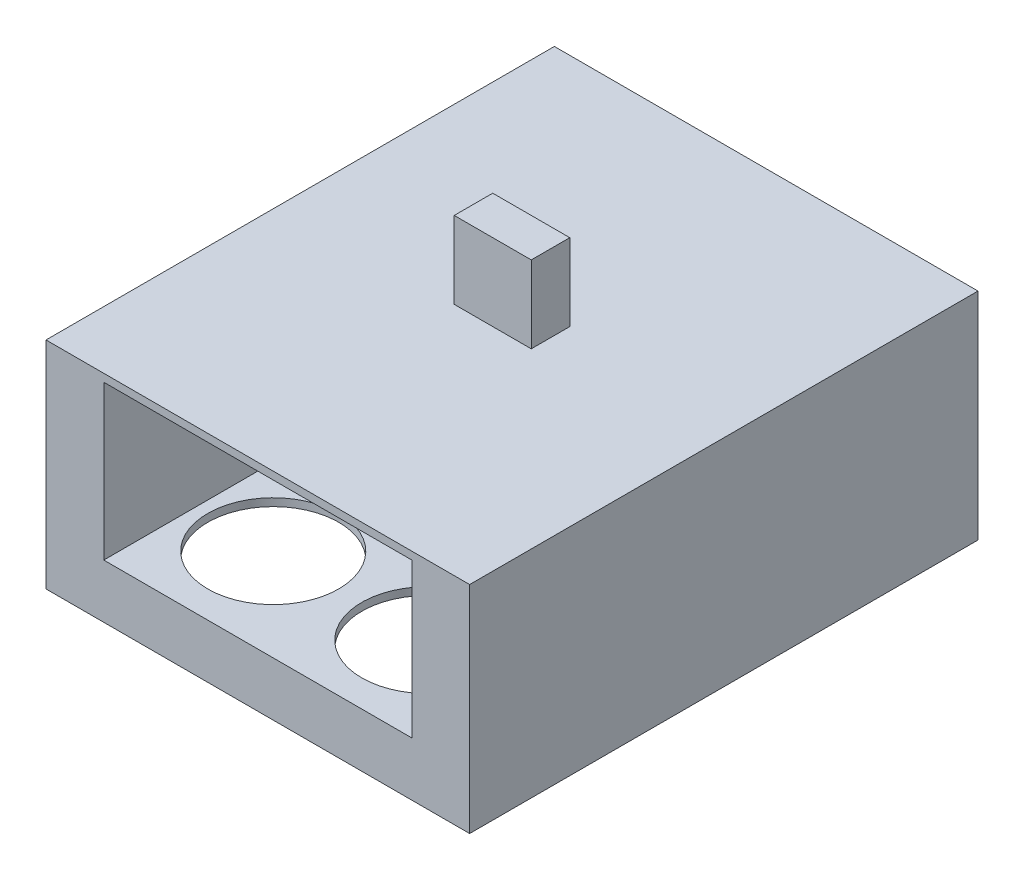
ISO-10303-21;
HEADER;
FILE_DESCRIPTION(('STEP AP214'),'2;1');
FILE_NAME('part.step','',(''),(''),'','','');
FILE_SCHEMA(('AUTOMOTIVE_DESIGN { 1 0 10303 214 1 1 1 1 }'));
ENDSEC;
DATA;
#1=APPLICATION_CONTEXT('core data for automotive mechanical design processes');
#2=APPLICATION_PROTOCOL_DEFINITION('international standard','automotive_design',2000,#1);
#3=PRODUCT_CONTEXT('',#1,'mechanical');
#4=PRODUCT('Part','Part','',(#3));
#5=PRODUCT_RELATED_PRODUCT_CATEGORY('part','',(#4));
#6=PRODUCT_DEFINITION_FORMATION('','',#4);
#7=PRODUCT_DEFINITION_CONTEXT('part definition',#1,'design');
#8=PRODUCT_DEFINITION('design','',#6,#7);
#9=PRODUCT_DEFINITION_SHAPE('','',#8);
#10=(LENGTH_UNIT() NAMED_UNIT(*) SI_UNIT(.MILLI.,.METRE.));
#11=(NAMED_UNIT(*) PLANE_ANGLE_UNIT() SI_UNIT($,.RADIAN.));
#12=(NAMED_UNIT(*) SI_UNIT($,.STERADIAN.) SOLID_ANGLE_UNIT());
#13=UNCERTAINTY_MEASURE_WITH_UNIT(LENGTH_MEASURE(1.E-05),#10,'distance_accuracy_value','');
#14=(GEOMETRIC_REPRESENTATION_CONTEXT(3) GLOBAL_UNCERTAINTY_ASSIGNED_CONTEXT((#13)) GLOBAL_UNIT_ASSIGNED_CONTEXT((#10,
#11,#12)) REPRESENTATION_CONTEXT('',''));
#15=CARTESIAN_POINT('',(0.,0.,0.));
#16=DIRECTION('',(0.,0.,1.));
#17=DIRECTION('',(1.,0.,0.));
#18=AXIS2_PLACEMENT_3D('',#15,#16,#17);
#19=CARTESIAN_POINT('',(-34.925,6.34999999999999,41.91));
#20=DIRECTION('',(1.,0.,0.));
#21=DIRECTION('',(0.,0.,-1.));
#22=AXIS2_PLACEMENT_3D('',#19,#20,#21);
#23=PLANE('',#22);
#24=DIRECTION('',(0.,-1.,0.));
#25=VECTOR('',#24,1.);
#26=CARTESIAN_POINT('',(-34.925,6.34999999999999,-41.91));
#27=LINE('',#26,#25);
#28=CARTESIAN_POINT('',(-34.925,31.75,-41.91));
#29=VERTEX_POINT('',#28);
#30=CARTESIAN_POINT('',(-34.925,-3.81000000000002,-41.91));
#31=VERTEX_POINT('',#30);
#32=EDGE_CURVE('E282',#29,#31,#27,.T.);
#33=ORIENTED_EDGE('',*,*,#32,.T.);
#34=DIRECTION('',(0.,0.,-1.));
#35=VECTOR('',#34,1.);
#36=CARTESIAN_POINT('',(-34.925,-3.81000000000002,-41.91));
#37=LINE('',#36,#35);
#38=CARTESIAN_POINT('',(-34.925,-3.81000000000002,41.91));
#39=VERTEX_POINT('',#38);
#40=EDGE_CURVE('E180',#39,#31,#37,.T.);
#41=ORIENTED_EDGE('',*,*,#40,.F.);
#42=DIRECTION('',(0.,-1.,0.));
#43=VECTOR('',#42,1.);
#44=CARTESIAN_POINT('',(-34.925,6.34999999999999,41.91));
#45=LINE('',#44,#43);
#46=CARTESIAN_POINT('',(-34.925,31.75,41.91));
#47=VERTEX_POINT('',#46);
#48=EDGE_CURVE('E44',#47,#39,#45,.T.);
#49=ORIENTED_EDGE('',*,*,#48,.F.);
#50=DIRECTION('',(0.,0.,1.));
#51=VECTOR('',#50,1.);
#52=CARTESIAN_POINT('',(-34.925,31.75,41.91));
#53=LINE('',#52,#51);
#54=EDGE_CURVE('E261',#29,#47,#53,.T.);
#55=ORIENTED_EDGE('',*,*,#54,.F.);
#56=EDGE_LOOP('',(#33,#41,#49,#55));
#57=FACE_BOUND('',#56,.T.);
#58=ADVANCED_FACE('F36',(#57),#23,.F.);
#59=CARTESIAN_POINT('',(34.925,0.,41.91));
#60=DIRECTION('',(-1.,0.,0.));
#61=DIRECTION('',(0.,0.,1.));
#62=AXIS2_PLACEMENT_3D('',#59,#60,#61);
#63=PLANE('',#62);
#64=DIRECTION('',(0.,1.,0.));
#65=VECTOR('',#64,1.);
#66=CARTESIAN_POINT('',(34.925,0.,-41.91));
#67=LINE('',#66,#65);
#68=CARTESIAN_POINT('',(34.925,-3.80999999999998,-41.91));
#69=VERTEX_POINT('',#68);
#70=CARTESIAN_POINT('',(34.925,31.75,-41.91));
#71=VERTEX_POINT('',#70);
#72=EDGE_CURVE('E39',#69,#71,#67,.T.);
#73=ORIENTED_EDGE('',*,*,#72,.T.);
#74=DIRECTION('',(0.,0.,-1.));
#75=VECTOR('',#74,1.);
#76=CARTESIAN_POINT('',(34.925,31.75,41.91));
#77=LINE('',#76,#75);
#78=CARTESIAN_POINT('',(34.925,31.75,41.91));
#79=VERTEX_POINT('',#78);
#80=EDGE_CURVE('E267',#79,#71,#77,.T.);
#81=ORIENTED_EDGE('',*,*,#80,.F.);
#82=DIRECTION('',(0.,1.,0.));
#83=VECTOR('',#82,1.);
#84=CARTESIAN_POINT('',(34.925,0.,41.91));
#85=LINE('',#84,#83);
#86=CARTESIAN_POINT('',(34.925,-3.80999999999998,41.91));
#87=VERTEX_POINT('',#86);
#88=EDGE_CURVE('E11',#87,#79,#85,.T.);
#89=ORIENTED_EDGE('',*,*,#88,.F.);
#90=DIRECTION('',(0.,0.,1.));
#91=VECTOR('',#90,1.);
#92=CARTESIAN_POINT('',(34.925,-3.80999999999998,-41.91));
#93=LINE('',#92,#91);
#94=EDGE_CURVE('E186',#69,#87,#93,.T.);
#95=ORIENTED_EDGE('',*,*,#94,.F.);
#96=EDGE_LOOP('',(#73,#81,#89,#95));
#97=FACE_BOUND('',#96,.T.);
#98=ADVANCED_FACE('F292',(#97),#63,.F.);
#99=CARTESIAN_POINT('',(0.,0.,41.91));
#100=DIRECTION('',(0.,0.,1.));
#101=DIRECTION('',(1.,0.,0.));
#102=AXIS2_PLACEMENT_3D('',#99,#100,#101);
#103=PLANE('',#102);
#104=DIRECTION('',(0.,1.,0.));
#105=VECTOR('',#104,1.);
#106=CARTESIAN_POINT('',(25.4,5.08,41.91));
#107=LINE('',#106,#105);
#108=CARTESIAN_POINT('',(25.4,5.08,41.91));
#109=VERTEX_POINT('',#108);
#110=CARTESIAN_POINT('',(25.4,30.48,41.91));
#111=VERTEX_POINT('',#110);
#112=EDGE_CURVE('E52',#109,#111,#107,.T.);
#113=ORIENTED_EDGE('',*,*,#112,.F.);
#114=DIRECTION('',(1.,0.,0.));
#115=VECTOR('',#114,1.);
#116=CARTESIAN_POINT('',(-25.4,5.08,41.91));
#117=LINE('',#116,#115);
#118=CARTESIAN_POINT('',(-25.4,5.08,41.91));
#119=VERTEX_POINT('',#118);
#120=EDGE_CURVE('E208',#119,#109,#117,.T.);
#121=ORIENTED_EDGE('',*,*,#120,.F.);
#122=DIRECTION('',(0.,-1.,0.));
#123=VECTOR('',#122,1.);
#124=CARTESIAN_POINT('',(-25.4,30.48,41.91));
#125=LINE('',#124,#123);
#126=CARTESIAN_POINT('',(-25.4,30.48,41.91));
#127=VERTEX_POINT('',#126);
#128=EDGE_CURVE('E222',#127,#119,#125,.T.);
#129=ORIENTED_EDGE('',*,*,#128,.F.);
#130=DIRECTION('',(-1.,0.,0.));
#131=VECTOR('',#130,1.);
#132=CARTESIAN_POINT('',(25.4,30.48,41.91));
#133=LINE('',#132,#131);
#134=EDGE_CURVE('E219',#111,#127,#133,.T.);
#135=ORIENTED_EDGE('',*,*,#134,.F.);
#136=EDGE_LOOP('',(#113,#121,#129,#135));
#137=FACE_BOUND('',#136,.T.);
#138=ORIENTED_EDGE('',*,*,#48,.T.);
#139=DIRECTION('',(-1.,0.,0.));
#140=VECTOR('',#139,1.);
#141=CARTESIAN_POINT('',(-34.925,-3.81000000000002,41.91));
#142=LINE('',#141,#140);
#143=EDGE_CURVE('E189',#87,#39,#142,.T.);
#144=ORIENTED_EDGE('',*,*,#143,.F.);
#145=ORIENTED_EDGE('',*,*,#88,.T.);
#146=DIRECTION('',(1.,0.,0.));
#147=VECTOR('',#146,1.);
#148=CARTESIAN_POINT('',(-34.925,31.75,41.91));
#149=LINE('',#148,#147);
#150=EDGE_CURVE('E264',#47,#79,#149,.T.);
#151=ORIENTED_EDGE('',*,*,#150,.F.);
#152=EDGE_LOOP('',(#138,#144,#145,#151));
#153=FACE_BOUND('',#152,.T.);
#154=ADVANCED_FACE('F302',(#137,#153),#103,.T.);
#155=CARTESIAN_POINT('',(0.,0.,-41.91));
#156=DIRECTION('',(0.,0.,1.));
#157=DIRECTION('',(1.,0.,0.));
#158=AXIS2_PLACEMENT_3D('',#155,#156,#157);
#159=PLANE('',#158);
#160=ORIENTED_EDGE('',*,*,#32,.F.);
#161=DIRECTION('',(-1.,0.,0.));
#162=VECTOR('',#161,1.);
#163=CARTESIAN_POINT('',(-34.925,31.75,-41.91));
#164=LINE('',#163,#162);
#165=EDGE_CURVE('E161',#71,#29,#164,.T.);
#166=ORIENTED_EDGE('',*,*,#165,.F.);
#167=ORIENTED_EDGE('',*,*,#72,.F.);
#168=DIRECTION('',(1.,0.,0.));
#169=VECTOR('',#168,1.);
#170=CARTESIAN_POINT('',(-34.925,-3.81000000000002,-41.91));
#171=LINE('',#170,#169);
#172=EDGE_CURVE('E183',#31,#69,#171,.T.);
#173=ORIENTED_EDGE('',*,*,#172,.F.);
#174=EDGE_LOOP('',(#160,#166,#167,#173));
#175=FACE_BOUND('',#174,.T.);
#176=ADVANCED_FACE('F298',(#175),#159,.F.);
#177=CARTESIAN_POINT('',(-32.385,6.34999999999999,41.91));
#178=DIRECTION('',(1.,0.,0.));
#179=DIRECTION('',(0.,0.,-1.));
#180=AXIS2_PLACEMENT_3D('',#177,#178,#179);
#181=PLANE('',#180);
#182=DIRECTION('',(0.,-1.,0.));
#183=VECTOR('',#182,1.);
#184=CARTESIAN_POINT('',(-32.385,6.34999999999999,-39.37));
#185=LINE('',#184,#183);
#186=CARTESIAN_POINT('',(-32.385,3.80999999999999,-39.37));
#187=VERTEX_POINT('',#186);
#188=CARTESIAN_POINT('',(-32.385,-3.81000000000002,-39.37));
#189=VERTEX_POINT('',#188);
#190=EDGE_CURVE('E149',#187,#189,#185,.T.);
#191=ORIENTED_EDGE('',*,*,#190,.F.);
#192=DIRECTION('',(0.,0.,-1.));
#193=VECTOR('',#192,1.);
#194=CARTESIAN_POINT('',(-32.385,3.80999999999999,41.91));
#195=LINE('',#194,#193);
#196=CARTESIAN_POINT('',(-32.385,3.80999999999999,39.37));
#197=VERTEX_POINT('',#196);
#198=EDGE_CURVE('E274',#197,#187,#195,.T.);
#199=ORIENTED_EDGE('',*,*,#198,.F.);
#200=DIRECTION('',(0.,-1.,0.));
#201=VECTOR('',#200,1.);
#202=CARTESIAN_POINT('',(-32.385,6.34999999999999,39.37));
#203=LINE('',#202,#201);
#204=CARTESIAN_POINT('',(-32.385,-3.81000000000002,39.37));
#205=VERTEX_POINT('',#204);
#206=EDGE_CURVE('E167',#197,#205,#203,.T.);
#207=ORIENTED_EDGE('',*,*,#206,.T.);
#208=DIRECTION('',(0.,0.,-1.));
#209=VECTOR('',#208,1.);
#210=CARTESIAN_POINT('',(-32.385,-3.81000000000002,-39.37));
#211=LINE('',#210,#209);
#212=EDGE_CURVE('E164',#205,#189,#211,.T.);
#213=ORIENTED_EDGE('',*,*,#212,.T.);
#214=EDGE_LOOP('',(#191,#199,#207,#213));
#215=FACE_BOUND('',#214,.T.);
#216=ADVANCED_FACE('F165',(#215),#181,.T.);
#217=CARTESIAN_POINT('',(32.385,0.,41.91));
#218=DIRECTION('',(-1.,0.,0.));
#219=DIRECTION('',(0.,0.,1.));
#220=AXIS2_PLACEMENT_3D('',#217,#218,#219);
#221=PLANE('',#220);
#222=DIRECTION('',(0.,1.,0.));
#223=VECTOR('',#222,1.);
#224=CARTESIAN_POINT('',(32.385,0.,-39.37));
#225=LINE('',#224,#223);
#226=CARTESIAN_POINT('',(32.385,-3.80999999999998,-39.37));
#227=VERTEX_POINT('',#226);
#228=CARTESIAN_POINT('',(32.385,3.81,-39.37));
#229=VERTEX_POINT('',#228);
#230=EDGE_CURVE('E160',#227,#229,#225,.T.);
#231=ORIENTED_EDGE('',*,*,#230,.F.);
#232=DIRECTION('',(0.,0.,1.));
#233=VECTOR('',#232,1.);
#234=CARTESIAN_POINT('',(32.385,-3.80999999999998,-39.37));
#235=LINE('',#234,#233);
#236=CARTESIAN_POINT('',(32.385,-3.80999999999998,39.37));
#237=VERTEX_POINT('',#236);
#238=EDGE_CURVE('E174',#227,#237,#235,.T.);
#239=ORIENTED_EDGE('',*,*,#238,.T.);
#240=DIRECTION('',(0.,1.,0.));
#241=VECTOR('',#240,1.);
#242=CARTESIAN_POINT('',(32.385,0.,39.37));
#243=LINE('',#242,#241);
#244=CARTESIAN_POINT('',(32.385,3.81,39.37));
#245=VERTEX_POINT('',#244);
#246=EDGE_CURVE('E273',#237,#245,#243,.T.);
#247=ORIENTED_EDGE('',*,*,#246,.T.);
#248=DIRECTION('',(0.,0.,-1.));
#249=VECTOR('',#248,1.);
#250=CARTESIAN_POINT('',(32.385,3.81,41.91));
#251=LINE('',#250,#249);
#252=EDGE_CURVE('E276',#245,#229,#251,.T.);
#253=ORIENTED_EDGE('',*,*,#252,.T.);
#254=EDGE_LOOP('',(#231,#239,#247,#253));
#255=FACE_BOUND('',#254,.T.);
#256=ADVANCED_FACE('F342',(#255),#221,.T.);
#257=CARTESIAN_POINT('',(34.925,3.81,41.91));
#258=DIRECTION('',(0.,-1.,0.));
#259=DIRECTION('',(1.,0.,0.));
#260=AXIS2_PLACEMENT_3D('',#257,#258,#259);
#261=PLANE('',#260);
#262=CARTESIAN_POINT('',(-12.7,3.80999999999999,26.67));
#263=DIRECTION('',(0.,-1.,0.));
#264=DIRECTION('',(1.,0.,0.));
#265=AXIS2_PLACEMENT_3D('',#262,#263,#264);
#266=CIRCLE('',#265,10.795);
#267=CARTESIAN_POINT('',(-1.905,3.81,26.67));
#268=VERTEX_POINT('',#267);
#269=EDGE_CURVE('E196',#268,#268,#266,.F.);
#270=ORIENTED_EDGE('',*,*,#269,.T.);
#271=EDGE_LOOP('',(#270));
#272=FACE_BOUND('',#271,.T.);
#273=CARTESIAN_POINT('',(12.7,3.81,26.67));
#274=DIRECTION('',(0.,-1.,0.));
#275=DIRECTION('',(1.,0.,0.));
#276=AXIS2_PLACEMENT_3D('',#273,#274,#275);
#277=CIRCLE('',#276,10.795);
#278=CARTESIAN_POINT('',(23.495,3.81,26.67));
#279=VERTEX_POINT('',#278);
#280=EDGE_CURVE('E192',#279,#279,#277,.F.);
#281=ORIENTED_EDGE('',*,*,#280,.T.);
#282=EDGE_LOOP('',(#281));
#283=FACE_BOUND('',#282,.T.);
#284=DIRECTION('',(-1.,0.,0.));
#285=VECTOR('',#284,1.);
#286=CARTESIAN_POINT('',(34.925,3.81,-39.37));
#287=LINE('',#286,#285);
#288=EDGE_CURVE('E156',#229,#187,#287,.T.);
#289=ORIENTED_EDGE('',*,*,#288,.F.);
#290=ORIENTED_EDGE('',*,*,#252,.F.);
#291=DIRECTION('',(-1.,0.,0.));
#292=VECTOR('',#291,1.);
#293=CARTESIAN_POINT('',(34.925,3.81,39.37));
#294=LINE('',#293,#292);
#295=EDGE_CURVE('E277',#245,#197,#294,.T.);
#296=ORIENTED_EDGE('',*,*,#295,.T.);
#297=ORIENTED_EDGE('',*,*,#198,.T.);
#298=EDGE_LOOP('',(#289,#290,#296,#297));
#299=FACE_BOUND('',#298,.T.);
#300=ADVANCED_FACE('F352',(#272,#283,#299),#261,.T.);
#301=CARTESIAN_POINT('',(0.,0.,39.37));
#302=DIRECTION('',(0.,0.,1.));
#303=DIRECTION('',(1.,0.,0.));
#304=AXIS2_PLACEMENT_3D('',#301,#302,#303);
#305=PLANE('',#304);
#306=ORIENTED_EDGE('',*,*,#206,.F.);
#307=ORIENTED_EDGE('',*,*,#295,.F.);
#308=ORIENTED_EDGE('',*,*,#246,.F.);
#309=DIRECTION('',(-1.,0.,0.));
#310=VECTOR('',#309,1.);
#311=CARTESIAN_POINT('',(-32.385,-3.81000000000002,39.37));
#312=LINE('',#311,#310);
#313=EDGE_CURVE('E176',#237,#205,#312,.T.);
#314=ORIENTED_EDGE('',*,*,#313,.T.);
#315=EDGE_LOOP('',(#306,#307,#308,#314));
#316=FACE_BOUND('',#315,.T.);
#317=ADVANCED_FACE('F361',(#316),#305,.F.);
#318=CARTESIAN_POINT('',(0.,0.,-39.37));
#319=DIRECTION('',(0.,0.,1.));
#320=DIRECTION('',(1.,0.,0.));
#321=AXIS2_PLACEMENT_3D('',#318,#319,#320);
#322=PLANE('',#321);
#323=ORIENTED_EDGE('',*,*,#190,.T.);
#324=DIRECTION('',(1.,0.,0.));
#325=VECTOR('',#324,1.);
#326=CARTESIAN_POINT('',(-32.385,-3.81000000000002,-39.37));
#327=LINE('',#326,#325);
#328=EDGE_CURVE('E153',#189,#227,#327,.T.);
#329=ORIENTED_EDGE('',*,*,#328,.T.);
#330=ORIENTED_EDGE('',*,*,#230,.T.);
#331=ORIENTED_EDGE('',*,*,#288,.T.);
#332=EDGE_LOOP('',(#323,#329,#330,#331));
#333=FACE_BOUND('',#332,.T.);
#334=ADVANCED_FACE('F151',(#333),#322,.T.);
#335=CARTESIAN_POINT('',(0.,31.75,0.));
#336=DIRECTION('',(0.,-1.,0.));
#337=DIRECTION('',(1.,0.,0.));
#338=AXIS2_PLACEMENT_3D('',#335,#336,#337);
#339=PLANE('',#338);
#340=DIRECTION('',(0.,0.,-1.));
#341=VECTOR('',#340,1.);
#342=CARTESIAN_POINT('',(6.35000000000002,31.75,3.175));
#343=LINE('',#342,#341);
#344=CARTESIAN_POINT('',(6.35000000000002,31.75,3.175));
#345=VERTEX_POINT('',#344);
#346=CARTESIAN_POINT('',(6.35000000000002,31.75,-3.175));
#347=VERTEX_POINT('',#346);
#348=EDGE_CURVE('E256',#345,#347,#343,.T.);
#349=ORIENTED_EDGE('',*,*,#348,.F.);
#350=DIRECTION('',(1.,0.,0.));
#351=VECTOR('',#350,1.);
#352=CARTESIAN_POINT('',(-6.35,31.75,3.175));
#353=LINE('',#352,#351);
#354=CARTESIAN_POINT('',(-6.35,31.75,3.175));
#355=VERTEX_POINT('',#354);
#356=EDGE_CURVE('E60',#355,#345,#353,.T.);
#357=ORIENTED_EDGE('',*,*,#356,.F.);
#358=DIRECTION('',(0.,0.,-1.));
#359=VECTOR('',#358,1.);
#360=CARTESIAN_POINT('',(-6.35,31.75,3.175));
#361=LINE('',#360,#359);
#362=CARTESIAN_POINT('',(-6.35,31.75,-3.175));
#363=VERTEX_POINT('',#362);
#364=EDGE_CURVE('E259',#355,#363,#361,.T.);
#365=ORIENTED_EDGE('',*,*,#364,.T.);
#366=DIRECTION('',(1.,0.,0.));
#367=VECTOR('',#366,1.);
#368=CARTESIAN_POINT('',(-6.35,31.75,-3.175));
#369=LINE('',#368,#367);
#370=EDGE_CURVE('E246',#363,#347,#369,.T.);
#371=ORIENTED_EDGE('',*,*,#370,.T.);
#372=EDGE_LOOP('',(#349,#357,#365,#371));
#373=FACE_BOUND('',#372,.T.);
#374=ORIENTED_EDGE('',*,*,#54,.T.);
#375=ORIENTED_EDGE('',*,*,#150,.T.);
#376=ORIENTED_EDGE('',*,*,#80,.T.);
#377=ORIENTED_EDGE('',*,*,#165,.T.);
#378=EDGE_LOOP('',(#374,#375,#376,#377));
#379=FACE_BOUND('',#378,.T.);
#380=ADVANCED_FACE('F296',(#373,#379),#339,.F.);
#381=CARTESIAN_POINT('',(-6.35,44.45,3.175));
#382=DIRECTION('',(1.,0.,0.));
#383=DIRECTION('',(0.,1.,0.));
#384=AXIS2_PLACEMENT_3D('',#381,#382,#383);
#385=PLANE('',#384);
#386=DIRECTION('',(0.,-1.,0.));
#387=VECTOR('',#386,1.);
#388=CARTESIAN_POINT('',(-6.35,44.45,-3.175));
#389=LINE('',#388,#387);
#390=CARTESIAN_POINT('',(-6.35,44.45,-3.175));
#391=VERTEX_POINT('',#390);
#392=EDGE_CURVE('E229',#391,#363,#389,.T.);
#393=ORIENTED_EDGE('',*,*,#392,.T.);
#394=ORIENTED_EDGE('',*,*,#364,.F.);
#395=DIRECTION('',(0.,-1.,0.));
#396=VECTOR('',#395,1.);
#397=CARTESIAN_POINT('',(-6.35,44.45,3.175));
#398=LINE('',#397,#396);
#399=CARTESIAN_POINT('',(-6.35,44.45,3.175));
#400=VERTEX_POINT('',#399);
#401=EDGE_CURVE('E235',#400,#355,#398,.T.);
#402=ORIENTED_EDGE('',*,*,#401,.F.);
#403=DIRECTION('',(0.,0.,-1.));
#404=VECTOR('',#403,1.);
#405=CARTESIAN_POINT('',(-6.35,44.45,3.175));
#406=LINE('',#405,#404);
#407=EDGE_CURVE('E243',#400,#391,#406,.T.);
#408=ORIENTED_EDGE('',*,*,#407,.T.);
#409=EDGE_LOOP('',(#393,#394,#402,#408));
#410=FACE_BOUND('',#409,.T.);
#411=ADVANCED_FACE('F471',(#410),#385,.F.);
#412=CARTESIAN_POINT('',(6.35000000000002,31.75,3.175));
#413=DIRECTION('',(-1.,0.,0.));
#414=DIRECTION('',(0.,-1.,0.));
#415=AXIS2_PLACEMENT_3D('',#412,#413,#414);
#416=PLANE('',#415);
#417=DIRECTION('',(0.,1.,0.));
#418=VECTOR('',#417,1.);
#419=CARTESIAN_POINT('',(6.35000000000002,31.75,-3.175));
#420=LINE('',#419,#418);
#421=CARTESIAN_POINT('',(6.35000000000001,44.45,-3.175));
#422=VERTEX_POINT('',#421);
#423=EDGE_CURVE('E248',#347,#422,#420,.T.);
#424=ORIENTED_EDGE('',*,*,#423,.T.);
#425=DIRECTION('',(0.,0.,-1.));
#426=VECTOR('',#425,1.);
#427=CARTESIAN_POINT('',(6.35000000000001,44.45,3.175));
#428=LINE('',#427,#426);
#429=CARTESIAN_POINT('',(6.35000000000001,44.45,3.175));
#430=VERTEX_POINT('',#429);
#431=EDGE_CURVE('E253',#430,#422,#428,.T.);
#432=ORIENTED_EDGE('',*,*,#431,.F.);
#433=DIRECTION('',(0.,1.,0.));
#434=VECTOR('',#433,1.);
#435=CARTESIAN_POINT('',(6.35000000000002,31.75,3.175));
#436=LINE('',#435,#434);
#437=EDGE_CURVE('E239',#345,#430,#436,.T.);
#438=ORIENTED_EDGE('',*,*,#437,.F.);
#439=ORIENTED_EDGE('',*,*,#348,.T.);
#440=EDGE_LOOP('',(#424,#432,#438,#439));
#441=FACE_BOUND('',#440,.T.);
#442=ADVANCED_FACE('F463',(#441),#416,.F.);
#443=CARTESIAN_POINT('',(6.35000000000001,44.45,3.175));
#444=DIRECTION('',(0.,-1.,0.));
#445=DIRECTION('',(1.,0.,0.));
#446=AXIS2_PLACEMENT_3D('',#443,#444,#445);
#447=PLANE('',#446);
#448=DIRECTION('',(-1.,0.,0.));
#449=VECTOR('',#448,1.);
#450=CARTESIAN_POINT('',(6.35000000000001,44.45,-3.175));
#451=LINE('',#450,#449);
#452=EDGE_CURVE('E237',#422,#391,#451,.T.);
#453=ORIENTED_EDGE('',*,*,#452,.T.);
#454=ORIENTED_EDGE('',*,*,#407,.F.);
#455=DIRECTION('',(-1.,0.,0.));
#456=VECTOR('',#455,1.);
#457=CARTESIAN_POINT('',(6.35000000000001,44.45,3.175));
#458=LINE('',#457,#456);
#459=EDGE_CURVE('E241',#430,#400,#458,.T.);
#460=ORIENTED_EDGE('',*,*,#459,.F.);
#461=ORIENTED_EDGE('',*,*,#431,.T.);
#462=EDGE_LOOP('',(#453,#454,#460,#461));
#463=FACE_BOUND('',#462,.T.);
#464=ADVANCED_FACE('F455',(#463),#447,.F.);
#465=CARTESIAN_POINT('',(0.,0.,3.175));
#466=DIRECTION('',(0.,0.,1.));
#467=DIRECTION('',(1.,0.,0.));
#468=AXIS2_PLACEMENT_3D('',#465,#466,#467);
#469=PLANE('',#468);
#470=ORIENTED_EDGE('',*,*,#401,.T.);
#471=ORIENTED_EDGE('',*,*,#356,.T.);
#472=ORIENTED_EDGE('',*,*,#437,.T.);
#473=ORIENTED_EDGE('',*,*,#459,.T.);
#474=EDGE_LOOP('',(#470,#471,#472,#473));
#475=FACE_BOUND('',#474,.T.);
#476=ADVANCED_FACE('F447',(#475),#469,.T.);
#477=CARTESIAN_POINT('',(0.,0.,-3.175));
#478=DIRECTION('',(0.,0.,1.));
#479=DIRECTION('',(1.,0.,0.));
#480=AXIS2_PLACEMENT_3D('',#477,#478,#479);
#481=PLANE('',#480);
#482=ORIENTED_EDGE('',*,*,#392,.F.);
#483=ORIENTED_EDGE('',*,*,#452,.F.);
#484=ORIENTED_EDGE('',*,*,#423,.F.);
#485=ORIENTED_EDGE('',*,*,#370,.F.);
#486=EDGE_LOOP('',(#482,#483,#484,#485));
#487=FACE_BOUND('',#486,.T.);
#488=ADVANCED_FACE('F440',(#487),#481,.F.);
#489=CARTESIAN_POINT('',(25.4,5.08,11.43));
#490=DIRECTION('',(1.,0.,0.));
#491=DIRECTION('',(0.,1.,0.));
#492=AXIS2_PLACEMENT_3D('',#489,#490,#491);
#493=PLANE('',#492);
#494=ORIENTED_EDGE('',*,*,#112,.T.);
#495=DIRECTION('',(0.,0.,1.));
#496=VECTOR('',#495,1.);
#497=CARTESIAN_POINT('',(25.4,30.48,11.43));
#498=LINE('',#497,#496);
#499=CARTESIAN_POINT('',(25.4,30.48,11.43));
#500=VERTEX_POINT('',#499);
#501=EDGE_CURVE('E217',#500,#111,#498,.T.);
#502=ORIENTED_EDGE('',*,*,#501,.F.);
#503=DIRECTION('',(0.,1.,0.));
#504=VECTOR('',#503,1.);
#505=CARTESIAN_POINT('',(25.4,5.08,11.43));
#506=LINE('',#505,#504);
#507=CARTESIAN_POINT('',(25.4,5.08,11.43));
#508=VERTEX_POINT('',#507);
#509=EDGE_CURVE('E204',#508,#500,#506,.T.);
#510=ORIENTED_EDGE('',*,*,#509,.F.);
#511=DIRECTION('',(0.,0.,1.));
#512=VECTOR('',#511,1.);
#513=CARTESIAN_POINT('',(25.4,5.08,11.43));
#514=LINE('',#513,#512);
#515=EDGE_CURVE('E227',#508,#109,#514,.T.);
#516=ORIENTED_EDGE('',*,*,#515,.T.);
#517=EDGE_LOOP('',(#494,#502,#510,#516));
#518=FACE_BOUND('',#517,.T.);
#519=ADVANCED_FACE('F433',(#518),#493,.F.);
#520=CARTESIAN_POINT('',(-25.4,5.08,11.43));
#521=DIRECTION('',(0.,-1.,0.));
#522=DIRECTION('',(0.,0.,-1.));
#523=AXIS2_PLACEMENT_3D('',#520,#521,#522);
#524=PLANE('',#523);
#525=CARTESIAN_POINT('',(-12.7,5.08,26.67));
#526=DIRECTION('',(0.,1.,0.));
#527=DIRECTION('',(0.,0.,1.));
#528=AXIS2_PLACEMENT_3D('',#525,#526,#527);
#529=CIRCLE('',#528,10.795);
#530=CARTESIAN_POINT('',(-12.7,5.08,37.465));
#531=VERTEX_POINT('',#530);
#532=EDGE_CURVE('E193',#531,#531,#529,.T.);
#533=ORIENTED_EDGE('',*,*,#532,.F.);
#534=EDGE_LOOP('',(#533));
#535=FACE_BOUND('',#534,.T.);
#536=CARTESIAN_POINT('',(12.7,5.08,26.67));
#537=DIRECTION('',(0.,1.,0.));
#538=DIRECTION('',(0.,0.,1.));
#539=AXIS2_PLACEMENT_3D('',#536,#537,#538);
#540=CIRCLE('',#539,10.795);
#541=CARTESIAN_POINT('',(12.7,5.08,37.465));
#542=VERTEX_POINT('',#541);
#543=EDGE_CURVE('E199',#542,#542,#540,.T.);
#544=ORIENTED_EDGE('',*,*,#543,.F.);
#545=EDGE_LOOP('',(#544));
#546=FACE_BOUND('',#545,.T.);
#547=ORIENTED_EDGE('',*,*,#120,.T.);
#548=ORIENTED_EDGE('',*,*,#515,.F.);
#549=DIRECTION('',(1.,0.,0.));
#550=VECTOR('',#549,1.);
#551=CARTESIAN_POINT('',(-25.4,5.08,11.43));
#552=LINE('',#551,#550);
#553=CARTESIAN_POINT('',(-25.4,5.08,11.43));
#554=VERTEX_POINT('',#553);
#555=EDGE_CURVE('E214',#554,#508,#552,.T.);
#556=ORIENTED_EDGE('',*,*,#555,.F.);
#557=DIRECTION('',(0.,0.,1.));
#558=VECTOR('',#557,1.);
#559=CARTESIAN_POINT('',(-25.4,5.08,11.43));
#560=LINE('',#559,#558);
#561=EDGE_CURVE('E230',#554,#119,#560,.T.);
#562=ORIENTED_EDGE('',*,*,#561,.T.);
#563=EDGE_LOOP('',(#547,#548,#556,#562));
#564=FACE_BOUND('',#563,.T.);
#565=ADVANCED_FACE('F425',(#535,#546,#564),#524,.F.);
#566=CARTESIAN_POINT('',(-25.4,30.48,11.43));
#567=DIRECTION('',(-1.,0.,0.));
#568=DIRECTION('',(0.,-1.,0.));
#569=AXIS2_PLACEMENT_3D('',#566,#567,#568);
#570=PLANE('',#569);
#571=ORIENTED_EDGE('',*,*,#128,.T.);
#572=ORIENTED_EDGE('',*,*,#561,.F.);
#573=DIRECTION('',(0.,-1.,0.));
#574=VECTOR('',#573,1.);
#575=CARTESIAN_POINT('',(-25.4,30.48,11.43));
#576=LINE('',#575,#574);
#577=CARTESIAN_POINT('',(-25.4,30.48,11.43));
#578=VERTEX_POINT('',#577);
#579=EDGE_CURVE('E211',#578,#554,#576,.T.);
#580=ORIENTED_EDGE('',*,*,#579,.F.);
#581=DIRECTION('',(0.,0.,1.));
#582=VECTOR('',#581,1.);
#583=CARTESIAN_POINT('',(-25.4,30.48,11.43));
#584=LINE('',#583,#582);
#585=EDGE_CURVE('E232',#578,#127,#584,.T.);
#586=ORIENTED_EDGE('',*,*,#585,.T.);
#587=EDGE_LOOP('',(#571,#572,#580,#586));
#588=FACE_BOUND('',#587,.T.);
#589=ADVANCED_FACE('F417',(#588),#570,.F.);
#590=CARTESIAN_POINT('',(25.4,30.48,11.43));
#591=DIRECTION('',(0.,1.,0.));
#592=DIRECTION('',(0.,0.,1.));
#593=AXIS2_PLACEMENT_3D('',#590,#591,#592);
#594=PLANE('',#593);
#595=ORIENTED_EDGE('',*,*,#134,.T.);
#596=ORIENTED_EDGE('',*,*,#585,.F.);
#597=DIRECTION('',(-1.,0.,0.));
#598=VECTOR('',#597,1.);
#599=CARTESIAN_POINT('',(25.4,30.48,11.43));
#600=LINE('',#599,#598);
#601=EDGE_CURVE('E207',#500,#578,#600,.T.);
#602=ORIENTED_EDGE('',*,*,#601,.F.);
#603=ORIENTED_EDGE('',*,*,#501,.T.);
#604=EDGE_LOOP('',(#595,#596,#602,#603));
#605=FACE_BOUND('',#604,.T.);
#606=ADVANCED_FACE('F408',(#605),#594,.F.);
#607=CARTESIAN_POINT('',(0.,0.,11.43));
#608=DIRECTION('',(0.,0.,1.));
#609=DIRECTION('',(1.,0.,0.));
#610=AXIS2_PLACEMENT_3D('',#607,#608,#609);
#611=PLANE('',#610);
#612=ORIENTED_EDGE('',*,*,#509,.T.);
#613=ORIENTED_EDGE('',*,*,#601,.T.);
#614=ORIENTED_EDGE('',*,*,#579,.T.);
#615=ORIENTED_EDGE('',*,*,#555,.T.);
#616=EDGE_LOOP('',(#612,#613,#614,#615));
#617=FACE_BOUND('',#616,.T.);
#618=ADVANCED_FACE('F399',(#617),#611,.T.);
#619=CARTESIAN_POINT('',(12.7,-0.00100000000004524,26.67));
#620=DIRECTION('',(0.,1.,0.));
#621=DIRECTION('',(0.,0.,1.));
#622=AXIS2_PLACEMENT_3D('',#619,#620,#621);
#623=CYLINDRICAL_SURFACE('',#622,10.795);
#624=ORIENTED_EDGE('',*,*,#280,.F.);
#625=EDGE_LOOP('',(#624));
#626=FACE_BOUND('',#625,.T.);
#627=ORIENTED_EDGE('',*,*,#543,.T.);
#628=EDGE_LOOP('',(#627));
#629=FACE_BOUND('',#628,.T.);
#630=ADVANCED_FACE('F391',(#626,#629),#623,.F.);
#631=CARTESIAN_POINT('',(-12.7,-0.00100000000004524,26.67));
#632=DIRECTION('',(0.,1.,0.));
#633=DIRECTION('',(0.,0.,1.));
#634=AXIS2_PLACEMENT_3D('',#631,#632,#633);
#635=CYLINDRICAL_SURFACE('',#634,10.795);
#636=ORIENTED_EDGE('',*,*,#269,.F.);
#637=EDGE_LOOP('',(#636));
#638=FACE_BOUND('',#637,.T.);
#639=ORIENTED_EDGE('',*,*,#532,.T.);
#640=EDGE_LOOP('',(#639));
#641=FACE_BOUND('',#640,.T.);
#642=ADVANCED_FACE('F383',(#638,#641),#635,.F.);
#643=CARTESIAN_POINT('',(0.,-3.81,0.));
#644=DIRECTION('',(0.,1.,0.));
#645=DIRECTION('',(-1.,0.,0.));
#646=AXIS2_PLACEMENT_3D('',#643,#644,#645);
#647=PLANE('',#646);
#648=ORIENTED_EDGE('',*,*,#40,.T.);
#649=ORIENTED_EDGE('',*,*,#172,.T.);
#650=ORIENTED_EDGE('',*,*,#94,.T.);
#651=ORIENTED_EDGE('',*,*,#143,.T.);
#652=EDGE_LOOP('',(#648,#649,#650,#651));
#653=FACE_BOUND('',#652,.T.);
#654=ORIENTED_EDGE('',*,*,#212,.F.);
#655=ORIENTED_EDGE('',*,*,#313,.F.);
#656=ORIENTED_EDGE('',*,*,#238,.F.);
#657=ORIENTED_EDGE('',*,*,#328,.F.);
#658=EDGE_LOOP('',(#654,#655,#656,#657));
#659=FACE_BOUND('',#658,.T.);
#660=ADVANCED_FACE('F172',(#653,#659),#647,.F.);
#661=CLOSED_SHELL('',(#58,#98,#154,#176,#216,#256,#300,#317,#334,#380,#411,#442,#464,#476,#488,
#519,#565,#589,#606,#618,#630,#642,#660));
#662=MANIFOLD_SOLID_BREP('B2',#661);
#663=ADVANCED_BREP_SHAPE_REPRESENTATION('',(#18,#662),#14);
#664=SHAPE_DEFINITION_REPRESENTATION(#9,#663);
ENDSEC;
END-ISO-10303-21;
